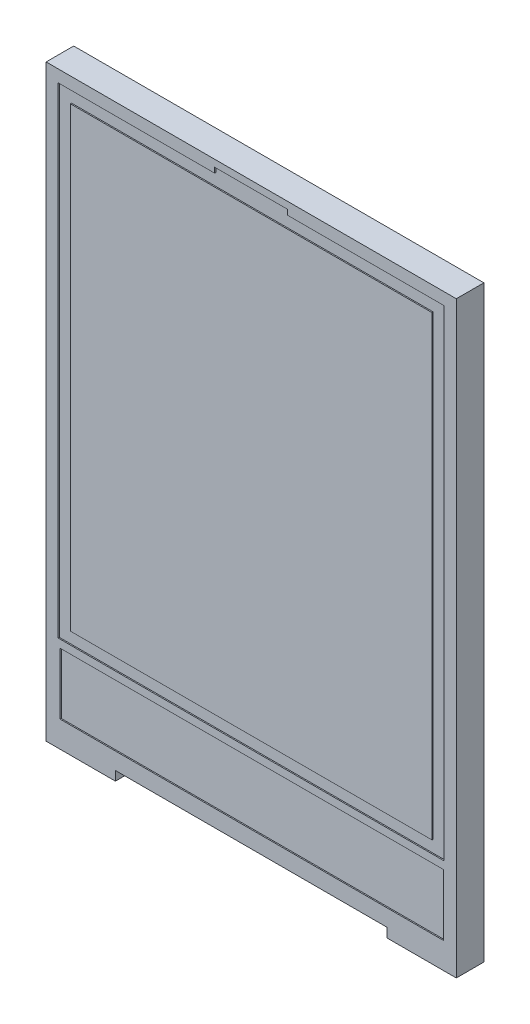
ISO-10303-21;
HEADER;
FILE_DESCRIPTION(('STEP AP214'),'2;1');
FILE_NAME('part.step','',(''),(''),'','','');
FILE_SCHEMA(('AUTOMOTIVE_DESIGN { 1 0 10303 214 1 1 1 1 }'));
ENDSEC;
DATA;
#1=APPLICATION_CONTEXT('core data for automotive mechanical design processes');
#2=APPLICATION_PROTOCOL_DEFINITION('international standard','automotive_design',2000,#1);
#3=PRODUCT_CONTEXT('',#1,'mechanical');
#4=PRODUCT('Part','Part','',(#3));
#5=PRODUCT_RELATED_PRODUCT_CATEGORY('part','',(#4));
#6=PRODUCT_DEFINITION_FORMATION('','',#4);
#7=PRODUCT_DEFINITION_CONTEXT('part definition',#1,'design');
#8=PRODUCT_DEFINITION('design','',#6,#7);
#9=PRODUCT_DEFINITION_SHAPE('','',#8);
#10=(LENGTH_UNIT() NAMED_UNIT(*) SI_UNIT(.MILLI.,.METRE.));
#11=(NAMED_UNIT(*) PLANE_ANGLE_UNIT() SI_UNIT($,.RADIAN.));
#12=(NAMED_UNIT(*) SI_UNIT($,.STERADIAN.) SOLID_ANGLE_UNIT());
#13=UNCERTAINTY_MEASURE_WITH_UNIT(LENGTH_MEASURE(1.E-05),#10,'distance_accuracy_value','');
#14=(GEOMETRIC_REPRESENTATION_CONTEXT(3) GLOBAL_UNCERTAINTY_ASSIGNED_CONTEXT((#13)) GLOBAL_UNIT_ASSIGNED_CONTEXT((#10,
#11,#12)) REPRESENTATION_CONTEXT('',''));
#15=CARTESIAN_POINT('',(0.,0.,0.));
#16=DIRECTION('',(0.,0.,1.));
#17=DIRECTION('',(1.,0.,0.));
#18=AXIS2_PLACEMENT_3D('',#15,#16,#17);
#19=CARTESIAN_POINT('',(0.,0.,-2.4));
#20=DIRECTION('',(0.,-1.,0.));
#21=DIRECTION('',(0.,0.,-1.));
#22=AXIS2_PLACEMENT_3D('',#19,#20,#21);
#23=PLANE('',#22);
#24=DIRECTION('',(0.,0.,1.));
#25=VECTOR('',#24,1.);
#26=CARTESIAN_POINT('',(6.03051628170633,0.,-2.4));
#27=LINE('',#26,#25);
#28=CARTESIAN_POINT('',(6.03051628170633,0.,-2.4));
#29=VERTEX_POINT('',#28);
#30=CARTESIAN_POINT('',(6.03051628170633,0.,0.));
#31=VERTEX_POINT('',#30);
#32=EDGE_CURVE('E195',#29,#31,#27,.T.);
#33=ORIENTED_EDGE('',*,*,#32,.T.);
#34=DIRECTION('',(1.,0.,0.));
#35=VECTOR('',#34,1.);
#36=CARTESIAN_POINT('',(0.,0.,0.));
#37=LINE('',#36,#35);
#38=CARTESIAN_POINT('',(0.,0.,0.));
#39=VERTEX_POINT('',#38);
#40=EDGE_CURVE('E236',#39,#31,#37,.T.);
#41=ORIENTED_EDGE('',*,*,#40,.F.);
#42=DIRECTION('',(0.,0.,1.));
#43=VECTOR('',#42,1.);
#44=CARTESIAN_POINT('',(0.,0.,-2.4));
#45=LINE('',#44,#43);
#46=CARTESIAN_POINT('',(0.,0.,-2.4));
#47=VERTEX_POINT('',#46);
#48=EDGE_CURVE('E36',#47,#39,#45,.T.);
#49=ORIENTED_EDGE('',*,*,#48,.F.);
#50=DIRECTION('',(1.,0.,0.));
#51=VECTOR('',#50,1.);
#52=CARTESIAN_POINT('',(0.,0.,-2.4));
#53=LINE('',#52,#51);
#54=EDGE_CURVE('E212',#47,#29,#53,.T.);
#55=ORIENTED_EDGE('',*,*,#54,.T.);
#56=EDGE_LOOP('',(#33,#41,#49,#55));
#57=FACE_BOUND('',#56,.T.);
#58=ADVANCED_FACE('F32',(#57),#23,.T.);
#59=CARTESIAN_POINT('',(0.,0.,-0.1));
#60=DIRECTION('',(0.,0.,1.));
#61=DIRECTION('',(1.,0.,0.));
#62=AXIS2_PLACEMENT_3D('',#59,#60,#61);
#63=PLANE('',#62);
#64=DIRECTION('',(0.,-1.,0.));
#65=VECTOR('',#64,1.);
#66=CARTESIAN_POINT('',(1.05331485546351,8.3,-0.1));
#67=LINE('',#66,#65);
#68=CARTESIAN_POINT('',(1.05331485546351,50.15,-0.1));
#69=VERTEX_POINT('',#68);
#70=CARTESIAN_POINT('',(1.05331485546351,8.3,-0.1));
#71=VERTEX_POINT('',#70);
#72=EDGE_CURVE('E331',#69,#71,#67,.T.);
#73=ORIENTED_EDGE('',*,*,#72,.T.);
#74=DIRECTION('',(1.,0.,0.));
#75=VECTOR('',#74,1.);
#76=CARTESIAN_POINT('',(34.6466851445365,8.3,-0.1));
#77=LINE('',#76,#75);
#78=CARTESIAN_POINT('',(34.6466851445365,8.3,-0.1));
#79=VERTEX_POINT('',#78);
#80=EDGE_CURVE('E362',#71,#79,#77,.T.);
#81=ORIENTED_EDGE('',*,*,#80,.T.);
#82=DIRECTION('',(0.,1.,0.));
#83=VECTOR('',#82,1.);
#84=CARTESIAN_POINT('',(34.6466851445365,8.3,-0.1));
#85=LINE('',#84,#83);
#86=CARTESIAN_POINT('',(34.6466851445365,50.15,-0.1));
#87=VERTEX_POINT('',#86);
#88=EDGE_CURVE('E352',#79,#87,#85,.T.);
#89=ORIENTED_EDGE('',*,*,#88,.T.);
#90=DIRECTION('',(-1.,0.,0.));
#91=VECTOR('',#90,1.);
#92=CARTESIAN_POINT('',(34.6466851445365,50.15,-0.1));
#93=LINE('',#92,#91);
#94=CARTESIAN_POINT('',(21.0264091893171,50.15,-0.1));
#95=VERTEX_POINT('',#94);
#96=EDGE_CURVE('E343',#87,#95,#93,.T.);
#97=ORIENTED_EDGE('',*,*,#96,.T.);
#98=DIRECTION('',(0.,1.,0.));
#99=VECTOR('',#98,1.);
#100=CARTESIAN_POINT('',(21.0264091893171,50.5994137226702,-0.1));
#101=LINE('',#100,#99);
#102=CARTESIAN_POINT('',(21.0264091893171,50.5994137226702,-0.1));
#103=VERTEX_POINT('',#102);
#104=EDGE_CURVE('E375',#95,#103,#101,.T.);
#105=ORIENTED_EDGE('',*,*,#104,.T.);
#106=DIRECTION('',(-1.,0.,0.));
#107=VECTOR('',#106,1.);
#108=CARTESIAN_POINT('',(14.6735908106829,50.5994137226702,-0.1));
#109=LINE('',#108,#107);
#110=CARTESIAN_POINT('',(14.6735908106829,50.5994137226702,-0.1));
#111=VERTEX_POINT('',#110);
#112=EDGE_CURVE('E384',#103,#111,#109,.T.);
#113=ORIENTED_EDGE('',*,*,#112,.T.);
#114=DIRECTION('',(0.,-1.,0.));
#115=VECTOR('',#114,1.);
#116=CARTESIAN_POINT('',(14.6735908106829,50.5994137226702,-0.1));
#117=LINE('',#116,#115);
#118=CARTESIAN_POINT('',(14.6735908106829,50.15,-0.1));
#119=VERTEX_POINT('',#118);
#120=EDGE_CURVE('E369',#111,#119,#117,.T.);
#121=ORIENTED_EDGE('',*,*,#120,.T.);
#122=EDGE_CURVE('E347',#119,#69,#93,.T.);
#123=ORIENTED_EDGE('',*,*,#122,.T.);
#124=EDGE_LOOP('',(#73,#81,#89,#97,#105,#113,#121,#123));
#125=FACE_BOUND('',#124,.T.);
#126=DIRECTION('',(1.,0.,0.));
#127=VECTOR('',#126,1.);
#128=CARTESIAN_POINT('',(33.5890170884589,9.35,-0.1));
#129=LINE('',#128,#127);
#130=CARTESIAN_POINT('',(2.11098291154115,9.35,-0.1));
#131=VERTEX_POINT('',#130);
#132=CARTESIAN_POINT('',(33.5890170884589,9.35,-0.1));
#133=VERTEX_POINT('',#132);
#134=EDGE_CURVE('E404',#131,#133,#129,.T.);
#135=ORIENTED_EDGE('',*,*,#134,.F.);
#136=DIRECTION('',(0.,-1.,0.));
#137=VECTOR('',#136,1.);
#138=CARTESIAN_POINT('',(2.11098291154115,9.35,-0.1));
#139=LINE('',#138,#137);
#140=CARTESIAN_POINT('',(2.11098291154115,49.1,-0.1));
#141=VERTEX_POINT('',#140);
#142=EDGE_CURVE('E406',#141,#131,#139,.T.);
#143=ORIENTED_EDGE('',*,*,#142,.F.);
#144=DIRECTION('',(-1.,0.,0.));
#145=VECTOR('',#144,1.);
#146=CARTESIAN_POINT('',(33.5890170884589,49.1,-0.1));
#147=LINE('',#146,#145);
#148=CARTESIAN_POINT('',(33.5890170884589,49.1,-0.1));
#149=VERTEX_POINT('',#148);
#150=EDGE_CURVE('E398',#149,#141,#147,.T.);
#151=ORIENTED_EDGE('',*,*,#150,.F.);
#152=DIRECTION('',(0.,1.,0.));
#153=VECTOR('',#152,1.);
#154=CARTESIAN_POINT('',(33.5890170884589,9.35,-0.1));
#155=LINE('',#154,#153);
#156=EDGE_CURVE('E401',#133,#149,#155,.T.);
#157=ORIENTED_EDGE('',*,*,#156,.F.);
#158=EDGE_LOOP('',(#135,#143,#151,#157));
#159=FACE_BOUND('',#158,.T.);
#160=ADVANCED_FACE('F271',(#125,#159),#63,.T.);
#161=CARTESIAN_POINT('',(34.6466851445365,50.15,-0.1));
#162=DIRECTION('',(0.,1.,0.));
#163=DIRECTION('',(0.,0.,1.));
#164=AXIS2_PLACEMENT_3D('',#161,#162,#163);
#165=PLANE('',#164);
#166=ORIENTED_EDGE('',*,*,#122,.F.);
#167=DIRECTION('',(0.,0.,1.));
#168=VECTOR('',#167,1.);
#169=CARTESIAN_POINT('',(14.6735908106829,50.15,-0.1));
#170=LINE('',#169,#168);
#171=CARTESIAN_POINT('',(14.6735908106829,50.15,0.));
#172=VERTEX_POINT('',#171);
#173=EDGE_CURVE('E356',#119,#172,#170,.T.);
#174=ORIENTED_EDGE('',*,*,#173,.T.);
#175=DIRECTION('',(-1.,0.,0.));
#176=VECTOR('',#175,1.);
#177=CARTESIAN_POINT('',(34.6466851445365,50.15,0.));
#178=LINE('',#177,#176);
#179=CARTESIAN_POINT('',(1.05331485546351,50.15,0.));
#180=VERTEX_POINT('',#179);
#181=EDGE_CURVE('E319',#172,#180,#178,.T.);
#182=ORIENTED_EDGE('',*,*,#181,.T.);
#183=DIRECTION('',(0.,0.,1.));
#184=VECTOR('',#183,1.);
#185=CARTESIAN_POINT('',(1.05331485546351,50.15,-0.1));
#186=LINE('',#185,#184);
#187=EDGE_CURVE('E235',#69,#180,#186,.T.);
#188=ORIENTED_EDGE('',*,*,#187,.F.);
#189=EDGE_LOOP('',(#166,#174,#182,#188));
#190=FACE_BOUND('',#189,.T.);
#191=ADVANCED_FACE('F275',(#190),#165,.F.);
#192=CARTESIAN_POINT('',(0.,0.,-2.4));
#193=DIRECTION('',(-1.,0.,0.));
#194=DIRECTION('',(0.,0.,1.));
#195=AXIS2_PLACEMENT_3D('',#192,#193,#194);
#196=PLANE('',#195);
#197=DIRECTION('',(0.,-1.,0.));
#198=VECTOR('',#197,1.);
#199=CARTESIAN_POINT('',(0.,0.,0.));
#200=LINE('',#199,#198);
#201=CARTESIAN_POINT('',(0.,51.2,0.));
#202=VERTEX_POINT('',#201);
#203=EDGE_CURVE('E231',#202,#39,#200,.T.);
#204=ORIENTED_EDGE('',*,*,#203,.F.);
#205=DIRECTION('',(0.,0.,1.));
#206=VECTOR('',#205,1.);
#207=CARTESIAN_POINT('',(0.,51.2,-2.4));
#208=LINE('',#207,#206);
#209=CARTESIAN_POINT('',(0.,51.2,-2.4));
#210=VERTEX_POINT('',#209);
#211=EDGE_CURVE('E11',#210,#202,#208,.T.);
#212=ORIENTED_EDGE('',*,*,#211,.F.);
#213=DIRECTION('',(0.,-1.,0.));
#214=VECTOR('',#213,1.);
#215=CARTESIAN_POINT('',(0.,0.,-2.4));
#216=LINE('',#215,#214);
#217=EDGE_CURVE('E225',#210,#47,#216,.T.);
#218=ORIENTED_EDGE('',*,*,#217,.T.);
#219=ORIENTED_EDGE('',*,*,#48,.T.);
#220=EDGE_LOOP('',(#204,#212,#218,#219));
#221=FACE_BOUND('',#220,.T.);
#222=ADVANCED_FACE('F34',(#221),#196,.T.);
#223=CARTESIAN_POINT('',(0.,51.2,-2.4));
#224=DIRECTION('',(0.,1.,0.));
#225=DIRECTION('',(0.,0.,1.));
#226=AXIS2_PLACEMENT_3D('',#223,#224,#225);
#227=PLANE('',#226);
#228=DIRECTION('',(-1.,0.,0.));
#229=VECTOR('',#228,1.);
#230=CARTESIAN_POINT('',(0.,51.2,0.));
#231=LINE('',#230,#229);
#232=CARTESIAN_POINT('',(35.7,51.2,0.));
#233=VERTEX_POINT('',#232);
#234=EDGE_CURVE('E241',#233,#202,#231,.T.);
#235=ORIENTED_EDGE('',*,*,#234,.F.);
#236=DIRECTION('',(0.,0.,1.));
#237=VECTOR('',#236,1.);
#238=CARTESIAN_POINT('',(35.7,51.2,-2.4));
#239=LINE('',#238,#237);
#240=CARTESIAN_POINT('',(35.7,51.2,-2.4));
#241=VERTEX_POINT('',#240);
#242=EDGE_CURVE('E41',#241,#233,#239,.T.);
#243=ORIENTED_EDGE('',*,*,#242,.F.);
#244=DIRECTION('',(-1.,0.,0.));
#245=VECTOR('',#244,1.);
#246=CARTESIAN_POINT('',(0.,51.2,-2.4));
#247=LINE('',#246,#245);
#248=EDGE_CURVE('E223',#241,#210,#247,.T.);
#249=ORIENTED_EDGE('',*,*,#248,.T.);
#250=ORIENTED_EDGE('',*,*,#211,.T.);
#251=EDGE_LOOP('',(#235,#243,#249,#250));
#252=FACE_BOUND('',#251,.T.);
#253=ADVANCED_FACE('F256',(#252),#227,.T.);
#254=CARTESIAN_POINT('',(35.7,0.,-2.4));
#255=DIRECTION('',(1.,0.,0.));
#256=DIRECTION('',(0.,1.,0.));
#257=AXIS2_PLACEMENT_3D('',#254,#255,#256);
#258=PLANE('',#257);
#259=DIRECTION('',(0.,1.,0.));
#260=VECTOR('',#259,1.);
#261=CARTESIAN_POINT('',(35.7,0.,0.));
#262=LINE('',#261,#260);
#263=CARTESIAN_POINT('',(35.7,0.,0.));
#264=VERTEX_POINT('',#263);
#265=EDGE_CURVE('E238',#264,#233,#262,.T.);
#266=ORIENTED_EDGE('',*,*,#265,.F.);
#267=DIRECTION('',(0.,0.,1.));
#268=VECTOR('',#267,1.);
#269=CARTESIAN_POINT('',(35.7,0.,-2.4));
#270=LINE('',#269,#268);
#271=CARTESIAN_POINT('',(35.7,0.,-2.4));
#272=VERTEX_POINT('',#271);
#273=EDGE_CURVE('E244',#272,#264,#270,.T.);
#274=ORIENTED_EDGE('',*,*,#273,.F.);
#275=DIRECTION('',(0.,1.,0.));
#276=VECTOR('',#275,1.);
#277=CARTESIAN_POINT('',(35.7,0.,-2.4));
#278=LINE('',#277,#276);
#279=EDGE_CURVE('E219',#272,#241,#278,.T.);
#280=ORIENTED_EDGE('',*,*,#279,.T.);
#281=ORIENTED_EDGE('',*,*,#242,.T.);
#282=EDGE_LOOP('',(#266,#274,#280,#281));
#283=FACE_BOUND('',#282,.T.);
#284=ADVANCED_FACE('F261',(#283),#258,.T.);
#285=DIRECTION('',(0.,0.,1.));
#286=VECTOR('',#285,1.);
#287=CARTESIAN_POINT('',(29.6694837182937,0.,-2.4));
#288=LINE('',#287,#286);
#289=CARTESIAN_POINT('',(29.6694837182937,0.,-2.4));
#290=VERTEX_POINT('',#289);
#291=CARTESIAN_POINT('',(29.6694837182937,0.,0.));
#292=VERTEX_POINT('',#291);
#293=EDGE_CURVE('E49',#290,#292,#288,.T.);
#294=ORIENTED_EDGE('',*,*,#293,.F.);
#295=EDGE_CURVE('E220',#290,#272,#53,.T.);
#296=ORIENTED_EDGE('',*,*,#295,.T.);
#297=ORIENTED_EDGE('',*,*,#273,.T.);
#298=EDGE_CURVE('E234',#292,#264,#37,.T.);
#299=ORIENTED_EDGE('',*,*,#298,.F.);
#300=EDGE_LOOP('',(#294,#296,#297,#299));
#301=FACE_BOUND('',#300,.T.);
#302=ADVANCED_FACE('F263',(#301),#23,.T.);
#303=CARTESIAN_POINT('',(0.,0.,-2.4));
#304=DIRECTION('',(0.,0.,-1.));
#305=DIRECTION('',(-1.,0.,0.));
#306=AXIS2_PLACEMENT_3D('',#303,#304,#305);
#307=PLANE('',#306);
#308=DIRECTION('',(0.,-1.,0.));
#309=VECTOR('',#308,1.);
#310=CARTESIAN_POINT('',(6.03051628170633,0.,-2.4));
#311=LINE('',#310,#309);
#312=CARTESIAN_POINT('',(6.03051628170633,0.807997653644633,-2.4));
#313=VERTEX_POINT('',#312);
#314=EDGE_CURVE('E198',#313,#29,#311,.T.);
#315=ORIENTED_EDGE('',*,*,#314,.T.);
#316=ORIENTED_EDGE('',*,*,#54,.F.);
#317=ORIENTED_EDGE('',*,*,#217,.F.);
#318=ORIENTED_EDGE('',*,*,#248,.F.);
#319=ORIENTED_EDGE('',*,*,#279,.F.);
#320=ORIENTED_EDGE('',*,*,#295,.F.);
#321=DIRECTION('',(0.,1.,0.));
#322=VECTOR('',#321,1.);
#323=CARTESIAN_POINT('',(29.6694837182937,0.,-2.4));
#324=LINE('',#323,#322);
#325=CARTESIAN_POINT('',(29.6694837182937,0.807997653644633,-2.4));
#326=VERTEX_POINT('',#325);
#327=EDGE_CURVE('E216',#290,#326,#324,.T.);
#328=ORIENTED_EDGE('',*,*,#327,.T.);
#329=DIRECTION('',(-1.,0.,0.));
#330=VECTOR('',#329,1.);
#331=CARTESIAN_POINT('',(6.03051628170633,0.807997653644633,-2.4));
#332=LINE('',#331,#330);
#333=EDGE_CURVE('E206',#326,#313,#332,.T.);
#334=ORIENTED_EDGE('',*,*,#333,.T.);
#335=EDGE_LOOP('',(#315,#316,#317,#318,#319,#320,#328,#334));
#336=FACE_BOUND('',#335,.T.);
#337=ADVANCED_FACE('F210',(#336),#307,.T.);
#338=CARTESIAN_POINT('',(0.,0.,0.));
#339=DIRECTION('',(0.,0.,-1.));
#340=DIRECTION('',(-1.,0.,0.));
#341=AXIS2_PLACEMENT_3D('',#338,#339,#340);
#342=PLANE('',#341);
#343=DIRECTION('',(1.,0.,0.));
#344=VECTOR('',#343,1.);
#345=CARTESIAN_POINT('',(1.22876857451388,2.27236042959695,0.));
#346=LINE('',#345,#344);
#347=CARTESIAN_POINT('',(1.22876857451388,2.27236042959695,0.));
#348=VERTEX_POINT('',#347);
#349=CARTESIAN_POINT('',(34.6026178869153,2.27236042959695,0.));
#350=VERTEX_POINT('',#349);
#351=EDGE_CURVE('E315',#348,#350,#346,.T.);
#352=ORIENTED_EDGE('',*,*,#351,.F.);
#353=DIRECTION('',(0.,-1.,0.));
#354=VECTOR('',#353,1.);
#355=CARTESIAN_POINT('',(1.22876857451388,7.61898730923678,0.));
#356=LINE('',#355,#354);
#357=CARTESIAN_POINT('',(1.22876857451388,7.61898730923678,0.));
#358=VERTEX_POINT('',#357);
#359=EDGE_CURVE('E57',#358,#348,#356,.T.);
#360=ORIENTED_EDGE('',*,*,#359,.F.);
#361=DIRECTION('',(-1.,0.,0.));
#362=VECTOR('',#361,1.);
#363=CARTESIAN_POINT('',(1.22876857451388,7.61898730923678,0.));
#364=LINE('',#363,#362);
#365=CARTESIAN_POINT('',(34.6026178869153,7.61898730923678,0.));
#366=VERTEX_POINT('',#365);
#367=EDGE_CURVE('E425',#366,#358,#364,.T.);
#368=ORIENTED_EDGE('',*,*,#367,.F.);
#369=DIRECTION('',(0.,1.,0.));
#370=VECTOR('',#369,1.);
#371=CARTESIAN_POINT('',(34.6026178869153,7.61898730923678,0.));
#372=LINE('',#371,#370);
#373=EDGE_CURVE('E429',#350,#366,#372,.T.);
#374=ORIENTED_EDGE('',*,*,#373,.F.);
#375=EDGE_LOOP('',(#352,#360,#368,#374));
#376=FACE_BOUND('',#375,.T.);
#377=ORIENTED_EDGE('',*,*,#181,.F.);
#378=DIRECTION('',(0.,-1.,0.));
#379=VECTOR('',#378,1.);
#380=CARTESIAN_POINT('',(14.6735908106829,50.5994137226702,0.));
#381=LINE('',#380,#379);
#382=CARTESIAN_POINT('',(14.6735908106829,50.5994137226702,0.));
#383=VERTEX_POINT('',#382);
#384=EDGE_CURVE('E321',#383,#172,#381,.T.);
#385=ORIENTED_EDGE('',*,*,#384,.F.);
#386=DIRECTION('',(-1.,0.,0.));
#387=VECTOR('',#386,1.);
#388=CARTESIAN_POINT('',(14.6735908106829,50.5994137226702,0.));
#389=LINE('',#388,#387);
#390=CARTESIAN_POINT('',(21.0264091893171,50.5994137226702,0.));
#391=VERTEX_POINT('',#390);
#392=EDGE_CURVE('E376',#391,#383,#389,.T.);
#393=ORIENTED_EDGE('',*,*,#392,.F.);
#394=DIRECTION('',(0.,1.,0.));
#395=VECTOR('',#394,1.);
#396=CARTESIAN_POINT('',(21.0264091893171,50.5994137226702,0.));
#397=LINE('',#396,#395);
#398=CARTESIAN_POINT('',(21.0264091893171,50.15,0.));
#399=VERTEX_POINT('',#398);
#400=EDGE_CURVE('E379',#399,#391,#397,.T.);
#401=ORIENTED_EDGE('',*,*,#400,.F.);
#402=CARTESIAN_POINT('',(34.6466851445365,50.15,0.));
#403=VERTEX_POINT('',#402);
#404=EDGE_CURVE('E327',#403,#399,#178,.T.);
#405=ORIENTED_EDGE('',*,*,#404,.F.);
#406=DIRECTION('',(0.,1.,0.));
#407=VECTOR('',#406,1.);
#408=CARTESIAN_POINT('',(34.6466851445365,8.3,0.));
#409=LINE('',#408,#407);
#410=CARTESIAN_POINT('',(34.6466851445365,8.3,0.));
#411=VERTEX_POINT('',#410);
#412=EDGE_CURVE('E328',#411,#403,#409,.T.);
#413=ORIENTED_EDGE('',*,*,#412,.F.);
#414=DIRECTION('',(1.,0.,0.));
#415=VECTOR('',#414,1.);
#416=CARTESIAN_POINT('',(34.6466851445365,8.3,0.));
#417=LINE('',#416,#415);
#418=CARTESIAN_POINT('',(1.05331485546351,8.3,0.));
#419=VERTEX_POINT('',#418);
#420=EDGE_CURVE('E333',#419,#411,#417,.T.);
#421=ORIENTED_EDGE('',*,*,#420,.F.);
#422=DIRECTION('',(0.,-1.,0.));
#423=VECTOR('',#422,1.);
#424=CARTESIAN_POINT('',(1.05331485546351,8.3,0.));
#425=LINE('',#424,#423);
#426=EDGE_CURVE('E323',#180,#419,#425,.T.);
#427=ORIENTED_EDGE('',*,*,#426,.F.);
#428=EDGE_LOOP('',(#377,#385,#393,#401,#405,#413,#421,#427));
#429=FACE_BOUND('',#428,.T.);
#430=ORIENTED_EDGE('',*,*,#40,.T.);
#431=DIRECTION('',(0.,-1.,0.));
#432=VECTOR('',#431,1.);
#433=CARTESIAN_POINT('',(6.03051628170633,0.,0.));
#434=LINE('',#433,#432);
#435=CARTESIAN_POINT('',(6.03051628170633,0.807997653644633,0.));
#436=VERTEX_POINT('',#435);
#437=EDGE_CURVE('E201',#436,#31,#434,.T.);
#438=ORIENTED_EDGE('',*,*,#437,.F.);
#439=DIRECTION('',(-1.,0.,0.));
#440=VECTOR('',#439,1.);
#441=CARTESIAN_POINT('',(6.03051628170633,0.807997653644633,0.));
#442=LINE('',#441,#440);
#443=CARTESIAN_POINT('',(29.6694837182937,0.807997653644633,0.));
#444=VERTEX_POINT('',#443);
#445=EDGE_CURVE('E217',#444,#436,#442,.T.);
#446=ORIENTED_EDGE('',*,*,#445,.F.);
#447=DIRECTION('',(0.,1.,0.));
#448=VECTOR('',#447,1.);
#449=CARTESIAN_POINT('',(29.6694837182937,0.,0.));
#450=LINE('',#449,#448);
#451=EDGE_CURVE('E451',#292,#444,#450,.T.);
#452=ORIENTED_EDGE('',*,*,#451,.F.);
#453=ORIENTED_EDGE('',*,*,#298,.T.);
#454=ORIENTED_EDGE('',*,*,#265,.T.);
#455=ORIENTED_EDGE('',*,*,#234,.T.);
#456=ORIENTED_EDGE('',*,*,#203,.T.);
#457=EDGE_LOOP('',(#430,#438,#446,#452,#453,#454,#455,#456));
#458=FACE_BOUND('',#457,.T.);
#459=ADVANCED_FACE('F253',(#376,#429,#458),#342,.F.);
#460=CARTESIAN_POINT('',(1.05331485546351,8.3,-0.1));
#461=DIRECTION('',(-1.,0.,0.));
#462=DIRECTION('',(0.,-1.,0.));
#463=AXIS2_PLACEMENT_3D('',#460,#461,#462);
#464=PLANE('',#463);
#465=ORIENTED_EDGE('',*,*,#426,.T.);
#466=DIRECTION('',(0.,0.,1.));
#467=VECTOR('',#466,1.);
#468=CARTESIAN_POINT('',(1.05331485546351,8.3,-0.1));
#469=LINE('',#468,#467);
#470=EDGE_CURVE('E341',#71,#419,#469,.T.);
#471=ORIENTED_EDGE('',*,*,#470,.F.);
#472=ORIENTED_EDGE('',*,*,#72,.F.);
#473=ORIENTED_EDGE('',*,*,#187,.T.);
#474=EDGE_LOOP('',(#465,#471,#472,#473));
#475=FACE_BOUND('',#474,.T.);
#476=ADVANCED_FACE('F292',(#475),#464,.F.);
#477=ORIENTED_EDGE('',*,*,#404,.T.);
#478=DIRECTION('',(0.,0.,1.));
#479=VECTOR('',#478,1.);
#480=CARTESIAN_POINT('',(21.0264091893171,50.15,-0.1));
#481=LINE('',#480,#479);
#482=EDGE_CURVE('E366',#95,#399,#481,.T.);
#483=ORIENTED_EDGE('',*,*,#482,.F.);
#484=ORIENTED_EDGE('',*,*,#96,.F.);
#485=DIRECTION('',(0.,0.,1.));
#486=VECTOR('',#485,1.);
#487=CARTESIAN_POINT('',(34.6466851445365,50.15,-0.1));
#488=LINE('',#487,#486);
#489=EDGE_CURVE('E338',#87,#403,#488,.T.);
#490=ORIENTED_EDGE('',*,*,#489,.T.);
#491=EDGE_LOOP('',(#477,#483,#484,#490));
#492=FACE_BOUND('',#491,.T.);
#493=ADVANCED_FACE('F283',(#492),#165,.F.);
#494=CARTESIAN_POINT('',(34.6466851445365,8.3,-0.1));
#495=DIRECTION('',(1.,0.,0.));
#496=DIRECTION('',(0.,0.,-1.));
#497=AXIS2_PLACEMENT_3D('',#494,#495,#496);
#498=PLANE('',#497);
#499=ORIENTED_EDGE('',*,*,#412,.T.);
#500=ORIENTED_EDGE('',*,*,#489,.F.);
#501=ORIENTED_EDGE('',*,*,#88,.F.);
#502=DIRECTION('',(0.,0.,1.));
#503=VECTOR('',#502,1.);
#504=CARTESIAN_POINT('',(34.6466851445365,8.3,-0.1));
#505=LINE('',#504,#503);
#506=EDGE_CURVE('E340',#79,#411,#505,.T.);
#507=ORIENTED_EDGE('',*,*,#506,.T.);
#508=EDGE_LOOP('',(#499,#500,#501,#507));
#509=FACE_BOUND('',#508,.T.);
#510=ADVANCED_FACE('F291',(#509),#498,.F.);
#511=CARTESIAN_POINT('',(34.6466851445365,8.3,-0.1));
#512=DIRECTION('',(0.,-1.,0.));
#513=DIRECTION('',(0.,0.,-1.));
#514=AXIS2_PLACEMENT_3D('',#511,#512,#513);
#515=PLANE('',#514);
#516=ORIENTED_EDGE('',*,*,#420,.T.);
#517=ORIENTED_EDGE('',*,*,#506,.F.);
#518=ORIENTED_EDGE('',*,*,#80,.F.);
#519=ORIENTED_EDGE('',*,*,#470,.T.);
#520=EDGE_LOOP('',(#516,#517,#518,#519));
#521=FACE_BOUND('',#520,.T.);
#522=ADVANCED_FACE('F296',(#521),#515,.F.);
#523=CARTESIAN_POINT('',(14.6735908106829,50.5994137226702,-0.1));
#524=DIRECTION('',(-1.,0.,0.));
#525=DIRECTION('',(0.,0.,1.));
#526=AXIS2_PLACEMENT_3D('',#523,#524,#525);
#527=PLANE('',#526);
#528=ORIENTED_EDGE('',*,*,#384,.T.);
#529=ORIENTED_EDGE('',*,*,#173,.F.);
#530=ORIENTED_EDGE('',*,*,#120,.F.);
#531=DIRECTION('',(0.,0.,1.));
#532=VECTOR('',#531,1.);
#533=CARTESIAN_POINT('',(14.6735908106829,50.5994137226702,-0.1));
#534=LINE('',#533,#532);
#535=EDGE_CURVE('E371',#111,#383,#534,.T.);
#536=ORIENTED_EDGE('',*,*,#535,.T.);
#537=EDGE_LOOP('',(#528,#529,#530,#536));
#538=FACE_BOUND('',#537,.T.);
#539=ADVANCED_FACE('F300',(#538),#527,.F.);
#540=CARTESIAN_POINT('',(14.6735908106829,50.5994137226702,-0.1));
#541=DIRECTION('',(0.,1.,0.));
#542=DIRECTION('',(0.,0.,1.));
#543=AXIS2_PLACEMENT_3D('',#540,#541,#542);
#544=PLANE('',#543);
#545=ORIENTED_EDGE('',*,*,#392,.T.);
#546=ORIENTED_EDGE('',*,*,#535,.F.);
#547=ORIENTED_EDGE('',*,*,#112,.F.);
#548=DIRECTION('',(0.,0.,1.));
#549=VECTOR('',#548,1.);
#550=CARTESIAN_POINT('',(21.0264091893171,50.5994137226702,-0.1));
#551=LINE('',#550,#549);
#552=EDGE_CURVE('E368',#103,#391,#551,.T.);
#553=ORIENTED_EDGE('',*,*,#552,.T.);
#554=EDGE_LOOP('',(#545,#546,#547,#553));
#555=FACE_BOUND('',#554,.T.);
#556=ADVANCED_FACE('F508',(#555),#544,.F.);
#557=CARTESIAN_POINT('',(21.0264091893171,50.5994137226702,-0.1));
#558=DIRECTION('',(1.,0.,0.));
#559=DIRECTION('',(0.,0.,-1.));
#560=AXIS2_PLACEMENT_3D('',#557,#558,#559);
#561=PLANE('',#560);
#562=ORIENTED_EDGE('',*,*,#400,.T.);
#563=ORIENTED_EDGE('',*,*,#552,.F.);
#564=ORIENTED_EDGE('',*,*,#104,.F.);
#565=ORIENTED_EDGE('',*,*,#482,.T.);
#566=EDGE_LOOP('',(#562,#563,#564,#565));
#567=FACE_BOUND('',#566,.T.);
#568=ADVANCED_FACE('F287',(#567),#561,.F.);
#569=CARTESIAN_POINT('',(2.11098291154115,9.35,0.));
#570=DIRECTION('',(1.,0.,0.));
#571=DIRECTION('',(0.,0.,-1.));
#572=AXIS2_PLACEMENT_3D('',#569,#570,#571);
#573=PLANE('',#572);
#574=ORIENTED_EDGE('',*,*,#142,.T.);
#575=DIRECTION('',(0.,0.,-1.));
#576=VECTOR('',#575,1.);
#577=CARTESIAN_POINT('',(2.11098291154115,9.35,0.));
#578=LINE('',#577,#576);
#579=CARTESIAN_POINT('',(2.11098291154115,9.35,0.));
#580=VERTEX_POINT('',#579);
#581=EDGE_CURVE('E382',#580,#131,#578,.T.);
#582=ORIENTED_EDGE('',*,*,#581,.F.);
#583=DIRECTION('',(0.,-1.,0.));
#584=VECTOR('',#583,1.);
#585=CARTESIAN_POINT('',(2.11098291154115,9.35,0.));
#586=LINE('',#585,#584);
#587=CARTESIAN_POINT('',(2.11098291154115,49.1,0.));
#588=VERTEX_POINT('',#587);
#589=EDGE_CURVE('E400',#588,#580,#586,.T.);
#590=ORIENTED_EDGE('',*,*,#589,.F.);
#591=DIRECTION('',(0.,0.,-1.));
#592=VECTOR('',#591,1.);
#593=CARTESIAN_POINT('',(2.11098291154115,49.1,0.));
#594=LINE('',#593,#592);
#595=EDGE_CURVE('E394',#588,#141,#594,.T.);
#596=ORIENTED_EDGE('',*,*,#595,.T.);
#597=EDGE_LOOP('',(#574,#582,#590,#596));
#598=FACE_BOUND('',#597,.T.);
#599=ADVANCED_FACE('F502',(#598),#573,.F.);
#600=CARTESIAN_POINT('',(33.5890170884589,9.35,0.));
#601=DIRECTION('',(0.,1.,0.));
#602=DIRECTION('',(0.,0.,1.));
#603=AXIS2_PLACEMENT_3D('',#600,#601,#602);
#604=PLANE('',#603);
#605=ORIENTED_EDGE('',*,*,#134,.T.);
#606=DIRECTION('',(0.,0.,-1.));
#607=VECTOR('',#606,1.);
#608=CARTESIAN_POINT('',(33.5890170884589,9.35,0.));
#609=LINE('',#608,#607);
#610=CARTESIAN_POINT('',(33.5890170884589,9.35,0.));
#611=VERTEX_POINT('',#610);
#612=EDGE_CURVE('E389',#611,#133,#609,.T.);
#613=ORIENTED_EDGE('',*,*,#612,.F.);
#614=DIRECTION('',(1.,0.,0.));
#615=VECTOR('',#614,1.);
#616=CARTESIAN_POINT('',(33.5890170884589,9.35,0.));
#617=LINE('',#616,#615);
#618=EDGE_CURVE('E413',#580,#611,#617,.T.);
#619=ORIENTED_EDGE('',*,*,#618,.F.);
#620=ORIENTED_EDGE('',*,*,#581,.T.);
#621=EDGE_LOOP('',(#605,#613,#619,#620));
#622=FACE_BOUND('',#621,.T.);
#623=ADVANCED_FACE('F498',(#622),#604,.F.);
#624=CARTESIAN_POINT('',(33.5890170884589,9.35,0.));
#625=DIRECTION('',(-1.,0.,0.));
#626=DIRECTION('',(0.,0.,1.));
#627=AXIS2_PLACEMENT_3D('',#624,#625,#626);
#628=PLANE('',#627);
#629=ORIENTED_EDGE('',*,*,#156,.T.);
#630=DIRECTION('',(0.,0.,-1.));
#631=VECTOR('',#630,1.);
#632=CARTESIAN_POINT('',(33.5890170884589,49.1,0.));
#633=LINE('',#632,#631);
#634=CARTESIAN_POINT('',(33.5890170884589,49.1,0.));
#635=VERTEX_POINT('',#634);
#636=EDGE_CURVE('E392',#635,#149,#633,.T.);
#637=ORIENTED_EDGE('',*,*,#636,.F.);
#638=DIRECTION('',(0.,1.,0.));
#639=VECTOR('',#638,1.);
#640=CARTESIAN_POINT('',(33.5890170884589,9.35,0.));
#641=LINE('',#640,#639);
#642=EDGE_CURVE('E411',#611,#635,#641,.T.);
#643=ORIENTED_EDGE('',*,*,#642,.F.);
#644=ORIENTED_EDGE('',*,*,#612,.T.);
#645=EDGE_LOOP('',(#629,#637,#643,#644));
#646=FACE_BOUND('',#645,.T.);
#647=ADVANCED_FACE('F494',(#646),#628,.F.);
#648=CARTESIAN_POINT('',(33.5890170884589,49.1,0.));
#649=DIRECTION('',(0.,-1.,0.));
#650=DIRECTION('',(0.,0.,-1.));
#651=AXIS2_PLACEMENT_3D('',#648,#649,#650);
#652=PLANE('',#651);
#653=ORIENTED_EDGE('',*,*,#150,.T.);
#654=ORIENTED_EDGE('',*,*,#595,.F.);
#655=DIRECTION('',(-1.,0.,0.));
#656=VECTOR('',#655,1.);
#657=CARTESIAN_POINT('',(33.5890170884589,49.1,0.));
#658=LINE('',#657,#656);
#659=EDGE_CURVE('E397',#635,#588,#658,.T.);
#660=ORIENTED_EDGE('',*,*,#659,.F.);
#661=ORIENTED_EDGE('',*,*,#636,.T.);
#662=EDGE_LOOP('',(#653,#654,#660,#661));
#663=FACE_BOUND('',#662,.T.);
#664=ADVANCED_FACE('F490',(#663),#652,.F.);
#665=CARTESIAN_POINT('',(0.,0.,0.));
#666=DIRECTION('',(0.,0.,1.));
#667=DIRECTION('',(1.,0.,0.));
#668=AXIS2_PLACEMENT_3D('',#665,#666,#667);
#669=PLANE('',#668);
#670=ORIENTED_EDGE('',*,*,#589,.T.);
#671=ORIENTED_EDGE('',*,*,#618,.T.);
#672=ORIENTED_EDGE('',*,*,#642,.T.);
#673=ORIENTED_EDGE('',*,*,#659,.T.);
#674=EDGE_LOOP('',(#670,#671,#672,#673));
#675=FACE_BOUND('',#674,.T.);
#676=ADVANCED_FACE('F487',(#675),#669,.T.);
#677=CARTESIAN_POINT('',(1.22876857451388,7.61898730923678,-0.1));
#678=DIRECTION('',(-1.,0.,0.));
#679=DIRECTION('',(0.,0.,1.));
#680=AXIS2_PLACEMENT_3D('',#677,#678,#679);
#681=PLANE('',#680);
#682=ORIENTED_EDGE('',*,*,#359,.T.);
#683=DIRECTION('',(0.,0.,1.));
#684=VECTOR('',#683,1.);
#685=CARTESIAN_POINT('',(1.22876857451388,2.27236042959695,-0.1));
#686=LINE('',#685,#684);
#687=CARTESIAN_POINT('',(1.22876857451388,2.27236042959695,-0.1));
#688=VERTEX_POINT('',#687);
#689=EDGE_CURVE('E417',#688,#348,#686,.T.);
#690=ORIENTED_EDGE('',*,*,#689,.F.);
#691=DIRECTION('',(0.,-1.,0.));
#692=VECTOR('',#691,1.);
#693=CARTESIAN_POINT('',(1.22876857451388,7.61898730923678,-0.1));
#694=LINE('',#693,#692);
#695=CARTESIAN_POINT('',(1.22876857451388,7.61898730923678,-0.1));
#696=VERTEX_POINT('',#695);
#697=EDGE_CURVE('E428',#696,#688,#694,.T.);
#698=ORIENTED_EDGE('',*,*,#697,.F.);
#699=DIRECTION('',(0.,0.,1.));
#700=VECTOR('',#699,1.);
#701=CARTESIAN_POINT('',(1.22876857451388,7.61898730923678,-0.1));
#702=LINE('',#701,#700);
#703=EDGE_CURVE('E409',#696,#358,#702,.T.);
#704=ORIENTED_EDGE('',*,*,#703,.T.);
#705=EDGE_LOOP('',(#682,#690,#698,#704));
#706=FACE_BOUND('',#705,.T.);
#707=ADVANCED_FACE('F477',(#706),#681,.F.);
#708=CARTESIAN_POINT('',(1.22876857451388,7.61898730923678,-0.1));
#709=DIRECTION('',(0.,1.,0.));
#710=DIRECTION('',(0.,0.,1.));
#711=AXIS2_PLACEMENT_3D('',#708,#709,#710);
#712=PLANE('',#711);
#713=ORIENTED_EDGE('',*,*,#367,.T.);
#714=ORIENTED_EDGE('',*,*,#703,.F.);
#715=DIRECTION('',(-1.,0.,0.));
#716=VECTOR('',#715,1.);
#717=CARTESIAN_POINT('',(1.22876857451388,7.61898730923678,-0.1));
#718=LINE('',#717,#716);
#719=CARTESIAN_POINT('',(34.6026178869153,7.61898730923678,-0.1));
#720=VERTEX_POINT('',#719);
#721=EDGE_CURVE('E420',#720,#696,#718,.T.);
#722=ORIENTED_EDGE('',*,*,#721,.F.);
#723=DIRECTION('',(0.,0.,1.));
#724=VECTOR('',#723,1.);
#725=CARTESIAN_POINT('',(34.6026178869153,7.61898730923678,-0.1));
#726=LINE('',#725,#724);
#727=EDGE_CURVE('E422',#720,#366,#726,.T.);
#728=ORIENTED_EDGE('',*,*,#727,.T.);
#729=EDGE_LOOP('',(#713,#714,#722,#728));
#730=FACE_BOUND('',#729,.T.);
#731=ADVANCED_FACE('F473',(#730),#712,.F.);
#732=CARTESIAN_POINT('',(34.6026178869153,7.61898730923678,-0.1));
#733=DIRECTION('',(1.,0.,0.));
#734=DIRECTION('',(0.,0.,-1.));
#735=AXIS2_PLACEMENT_3D('',#732,#733,#734);
#736=PLANE('',#735);
#737=ORIENTED_EDGE('',*,*,#373,.T.);
#738=ORIENTED_EDGE('',*,*,#727,.F.);
#739=DIRECTION('',(0.,1.,0.));
#740=VECTOR('',#739,1.);
#741=CARTESIAN_POINT('',(34.6026178869153,7.61898730923678,-0.1));
#742=LINE('',#741,#740);
#743=CARTESIAN_POINT('',(34.6026178869153,2.27236042959695,-0.1));
#744=VERTEX_POINT('',#743);
#745=EDGE_CURVE('E437',#744,#720,#742,.T.);
#746=ORIENTED_EDGE('',*,*,#745,.F.);
#747=DIRECTION('',(0.,0.,1.));
#748=VECTOR('',#747,1.);
#749=CARTESIAN_POINT('',(34.6026178869153,2.27236042959695,-0.1));
#750=LINE('',#749,#748);
#751=EDGE_CURVE('E419',#744,#350,#750,.T.);
#752=ORIENTED_EDGE('',*,*,#751,.T.);
#753=EDGE_LOOP('',(#737,#738,#746,#752));
#754=FACE_BOUND('',#753,.T.);
#755=ADVANCED_FACE('F476',(#754),#736,.F.);
#756=CARTESIAN_POINT('',(1.22876857451388,2.27236042959695,-0.1));
#757=DIRECTION('',(0.,-1.,0.));
#758=DIRECTION('',(0.,0.,-1.));
#759=AXIS2_PLACEMENT_3D('',#756,#757,#758);
#760=PLANE('',#759);
#761=ORIENTED_EDGE('',*,*,#351,.T.);
#762=ORIENTED_EDGE('',*,*,#751,.F.);
#763=DIRECTION('',(1.,0.,0.));
#764=VECTOR('',#763,1.);
#765=CARTESIAN_POINT('',(1.22876857451388,2.27236042959695,-0.1));
#766=LINE('',#765,#764);
#767=EDGE_CURVE('E440',#688,#744,#766,.T.);
#768=ORIENTED_EDGE('',*,*,#767,.F.);
#769=ORIENTED_EDGE('',*,*,#689,.T.);
#770=EDGE_LOOP('',(#761,#762,#768,#769));
#771=FACE_BOUND('',#770,.T.);
#772=ADVANCED_FACE('F471',(#771),#760,.F.);
#773=CARTESIAN_POINT('',(0.,0.,-0.1));
#774=DIRECTION('',(0.,0.,1.));
#775=DIRECTION('',(1.,0.,0.));
#776=AXIS2_PLACEMENT_3D('',#773,#774,#775);
#777=PLANE('',#776);
#778=ORIENTED_EDGE('',*,*,#697,.T.);
#779=ORIENTED_EDGE('',*,*,#767,.T.);
#780=ORIENTED_EDGE('',*,*,#745,.T.);
#781=ORIENTED_EDGE('',*,*,#721,.T.);
#782=EDGE_LOOP('',(#778,#779,#780,#781));
#783=FACE_BOUND('',#782,.T.);
#784=ADVANCED_FACE('F466',(#783),#777,.T.);
#785=CARTESIAN_POINT('',(6.03051628170633,0.,-2.4));
#786=DIRECTION('',(-1.,0.,0.));
#787=DIRECTION('',(0.,0.,1.));
#788=AXIS2_PLACEMENT_3D('',#785,#786,#787);
#789=PLANE('',#788);
#790=ORIENTED_EDGE('',*,*,#437,.T.);
#791=ORIENTED_EDGE('',*,*,#32,.F.);
#792=ORIENTED_EDGE('',*,*,#314,.F.);
#793=DIRECTION('',(0.,0.,1.));
#794=VECTOR('',#793,1.);
#795=CARTESIAN_POINT('',(6.03051628170633,0.807997653644633,-2.4));
#796=LINE('',#795,#794);
#797=EDGE_CURVE('E434',#313,#436,#796,.T.);
#798=ORIENTED_EDGE('',*,*,#797,.T.);
#799=EDGE_LOOP('',(#790,#791,#792,#798));
#800=FACE_BOUND('',#799,.T.);
#801=ADVANCED_FACE('F197',(#800),#789,.F.);
#802=CARTESIAN_POINT('',(6.03051628170633,0.807997653644633,-2.4));
#803=DIRECTION('',(0.,1.,0.));
#804=DIRECTION('',(0.,0.,1.));
#805=AXIS2_PLACEMENT_3D('',#802,#803,#804);
#806=PLANE('',#805);
#807=ORIENTED_EDGE('',*,*,#445,.T.);
#808=ORIENTED_EDGE('',*,*,#797,.F.);
#809=ORIENTED_EDGE('',*,*,#333,.F.);
#810=DIRECTION('',(0.,0.,1.));
#811=VECTOR('',#810,1.);
#812=CARTESIAN_POINT('',(29.6694837182937,0.807997653644633,-2.4));
#813=LINE('',#812,#811);
#814=EDGE_CURVE('E446',#326,#444,#813,.T.);
#815=ORIENTED_EDGE('',*,*,#814,.T.);
#816=EDGE_LOOP('',(#807,#808,#809,#815));
#817=FACE_BOUND('',#816,.T.);
#818=ADVANCED_FACE('F458',(#817),#806,.F.);
#819=CARTESIAN_POINT('',(29.6694837182937,0.,-2.4));
#820=DIRECTION('',(1.,0.,0.));
#821=DIRECTION('',(0.,0.,-1.));
#822=AXIS2_PLACEMENT_3D('',#819,#820,#821);
#823=PLANE('',#822);
#824=ORIENTED_EDGE('',*,*,#451,.T.);
#825=ORIENTED_EDGE('',*,*,#814,.F.);
#826=ORIENTED_EDGE('',*,*,#327,.F.);
#827=ORIENTED_EDGE('',*,*,#293,.T.);
#828=EDGE_LOOP('',(#824,#825,#826,#827));
#829=FACE_BOUND('',#828,.T.);
#830=ADVANCED_FACE('F455',(#829),#823,.F.);
#831=CLOSED_SHELL('',(#58,#160,#191,#222,#253,#284,#302,#337,#459,#476,#493,#510,#522,#539,#556,
#568,#599,#623,#647,#664,#676,#707,#731,#755,#772,#784,#801,#818,#830));
#832=MANIFOLD_SOLID_BREP('B2',#831);
#833=ADVANCED_BREP_SHAPE_REPRESENTATION('',(#18,#832),#14);
#834=SHAPE_DEFINITION_REPRESENTATION(#9,#833);
ENDSEC;
END-ISO-10303-21;
